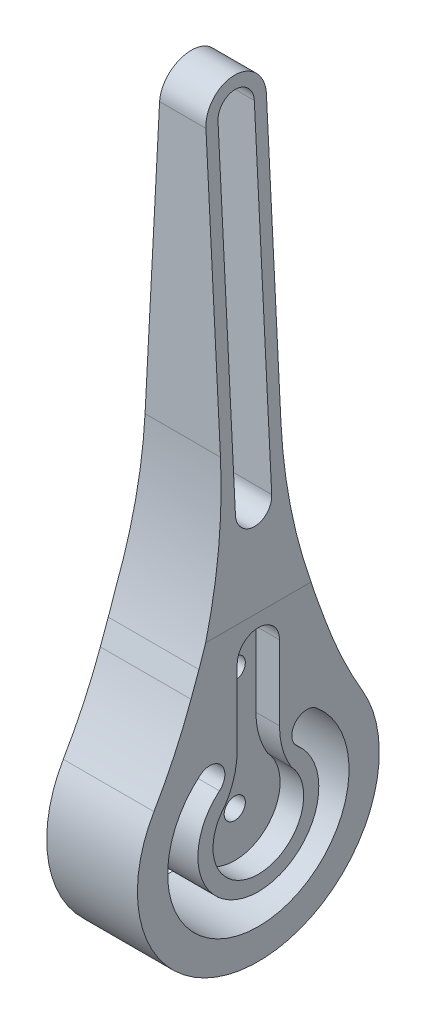
ISO-10303-21;
HEADER;
FILE_DESCRIPTION(('STEP AP214'),'2;1');
FILE_NAME('part.step','',(''),(''),'','','');
FILE_SCHEMA(('AUTOMOTIVE_DESIGN { 1 0 10303 214 1 1 1 1 }'));
ENDSEC;
DATA;
#1=APPLICATION_CONTEXT('core data for automotive mechanical design processes');
#2=APPLICATION_PROTOCOL_DEFINITION('international standard','automotive_design',2000,#1);
#3=PRODUCT_CONTEXT('',#1,'mechanical');
#4=PRODUCT('Part','Part','',(#3));
#5=PRODUCT_RELATED_PRODUCT_CATEGORY('part','',(#4));
#6=PRODUCT_DEFINITION_FORMATION('','',#4);
#7=PRODUCT_DEFINITION_CONTEXT('part definition',#1,'design');
#8=PRODUCT_DEFINITION('design','',#6,#7);
#9=PRODUCT_DEFINITION_SHAPE('','',#8);
#10=(LENGTH_UNIT() NAMED_UNIT(*) SI_UNIT(.MILLI.,.METRE.));
#11=(NAMED_UNIT(*) PLANE_ANGLE_UNIT() SI_UNIT($,.RADIAN.));
#12=(NAMED_UNIT(*) SI_UNIT($,.STERADIAN.) SOLID_ANGLE_UNIT());
#13=UNCERTAINTY_MEASURE_WITH_UNIT(LENGTH_MEASURE(1.E-05),#10,'distance_accuracy_value','');
#14=(GEOMETRIC_REPRESENTATION_CONTEXT(3) GLOBAL_UNCERTAINTY_ASSIGNED_CONTEXT((#13)) GLOBAL_UNIT_ASSIGNED_CONTEXT((#10,
#11,#12)) REPRESENTATION_CONTEXT('',''));
#15=CARTESIAN_POINT('',(0.,0.,0.));
#16=DIRECTION('',(0.,0.,1.));
#17=DIRECTION('',(1.,0.,0.));
#18=AXIS2_PLACEMENT_3D('',#15,#16,#17);
#19=CARTESIAN_POINT('',(-15.,50.4972860024262,86.3135221526105));
#20=DIRECTION('',(-1.,0.,0.));
#21=DIRECTION('',(0.,0.,1.));
#22=AXIS2_PLACEMENT_3D('',#19,#20,#21);
#23=PLANE('',#22);
#24=CARTESIAN_POINT('',(-15.,20.,0.));
#25=DIRECTION('',(1.,0.,0.));
#26=DIRECTION('',(0.,0.,-1.));
#27=AXIS2_PLACEMENT_3D('',#24,#25,#26);
#28=CIRCLE('',#27,1.75);
#29=CARTESIAN_POINT('',(-15.,20.,-1.75));
#30=VERTEX_POINT('',#29);
#31=EDGE_CURVE('E307',#30,#30,#28,.T.);
#32=ORIENTED_EDGE('',*,*,#31,.T.);
#33=EDGE_LOOP('',(#32));
#34=FACE_BOUND('',#33,.T.);
#35=CARTESIAN_POINT('',(-15.,24.,0.));
#36=DIRECTION('',(1.,0.,0.));
#37=DIRECTION('',(0.,0.,-1.));
#38=AXIS2_PLACEMENT_3D('',#35,#36,#37);
#39=CIRCLE('',#38,1.75);
#40=CARTESIAN_POINT('',(-15.,24.,-1.75));
#41=VERTEX_POINT('',#40);
#42=EDGE_CURVE('E299',#41,#41,#39,.T.);
#43=ORIENTED_EDGE('',*,*,#42,.T.);
#44=EDGE_LOOP('',(#43));
#45=FACE_BOUND('',#44,.T.);
#46=CARTESIAN_POINT('',(-15.,0.,0.));
#47=DIRECTION('',(1.,0.,0.));
#48=DIRECTION('',(0.,0.,-1.));
#49=AXIS2_PLACEMENT_3D('',#46,#47,#48);
#50=CIRCLE('',#49,1.75);
#51=CARTESIAN_POINT('',(-15.,0.,-1.75));
#52=VERTEX_POINT('',#51);
#53=EDGE_CURVE('E294',#52,#52,#50,.T.);
#54=ORIENTED_EDGE('',*,*,#53,.T.);
#55=EDGE_LOOP('',(#54));
#56=FACE_BOUND('',#55,.T.);
#57=DIRECTION('',(0.,0.,1.));
#58=VECTOR('',#57,1.);
#59=CARTESIAN_POINT('',(-15.,30.,-20.));
#60=LINE('',#59,#58);
#61=CARTESIAN_POINT('',(-15.,30.,-8.71833035085308));
#62=VERTEX_POINT('',#61);
#63=CARTESIAN_POINT('',(-15.,30.,8.71833035085308));
#64=VERTEX_POINT('',#63);
#65=EDGE_CURVE('E247',#62,#64,#60,.T.);
#66=ORIENTED_EDGE('',*,*,#65,.F.);
#67=CARTESIAN_POINT('',(-15.,54.1061584566769,-85.));
#68=DIRECTION('',(-1.,0.,0.));
#69=DIRECTION('',(0.,0.,1.));
#70=AXIS2_PLACEMENT_3D('',#67,#68,#69);
#71=CIRCLE('',#70,80.);
#72=CARTESIAN_POINT('',(-15.,26.7445469906236,-9.82459033712727));
#73=VERTEX_POINT('',#72);
#74=EDGE_CURVE('E386',#73,#62,#71,.T.);
#75=ORIENTED_EDGE('',*,*,#74,.F.);
#76=DIRECTION('',(0.,0.939692620785911,0.342020143325663));
#77=VECTOR('',#76,1.);
#78=CARTESIAN_POINT('',(-15.,26.7445469906236,-9.82459033712725));
#79=LINE('',#78,#77);
#80=CARTESIAN_POINT('',(-15.,23.1356745363731,-11.1381124897376));
#81=VERTEX_POINT('',#80);
#82=EDGE_CURVE('E383',#81,#73,#79,.T.);
#83=ORIENTED_EDGE('',*,*,#82,.F.);
#84=CARTESIAN_POINT('',(-15.,50.4972860024262,-86.3135221526105));
#85=DIRECTION('',(-1.,0.,0.));
#86=DIRECTION('',(0.,0.,-1.));
#87=AXIS2_PLACEMENT_3D('',#84,#85,#86);
#88=CIRCLE('',#87,80.);
#89=CARTESIAN_POINT('',(-15.,10.0994572004852,-17.2627044305221));
#90=VERTEX_POINT('',#89);
#91=EDGE_CURVE('E380',#90,#81,#88,.T.);
#92=ORIENTED_EDGE('',*,*,#91,.F.);
#93=CARTESIAN_POINT('',(-15.,0.,0.));
#94=DIRECTION('',(1.,0.,0.));
#95=DIRECTION('',(0.,0.,-1.));
#96=AXIS2_PLACEMENT_3D('',#93,#94,#95);
#97=CIRCLE('',#96,20.);
#98=CARTESIAN_POINT('',(-15.,10.0994572004852,17.2627044305221));
#99=VERTEX_POINT('',#98);
#100=EDGE_CURVE('E376',#99,#90,#97,.T.);
#101=ORIENTED_EDGE('',*,*,#100,.F.);
#102=CARTESIAN_POINT('',(-15.,50.4972860024262,86.3135221526105));
#103=DIRECTION('',(-1.,0.,0.));
#104=DIRECTION('',(0.,0.,1.));
#105=AXIS2_PLACEMENT_3D('',#102,#103,#104);
#106=CIRCLE('',#105,80.);
#107=CARTESIAN_POINT('',(-15.,23.1356745363731,11.1381124897376));
#108=VERTEX_POINT('',#107);
#109=EDGE_CURVE('E373',#108,#99,#106,.T.);
#110=ORIENTED_EDGE('',*,*,#109,.F.);
#111=DIRECTION('',(0.,-0.939692620785911,0.342020143325663));
#112=VECTOR('',#111,1.);
#113=CARTESIAN_POINT('',(-15.,26.7445469906236,9.82459033712725));
#114=LINE('',#113,#112);
#115=CARTESIAN_POINT('',(-15.,26.7445469906236,9.82459033712725));
#116=VERTEX_POINT('',#115);
#117=EDGE_CURVE('E391',#116,#108,#114,.T.);
#118=ORIENTED_EDGE('',*,*,#117,.F.);
#119=CARTESIAN_POINT('',(-15.,54.1061584566769,85.));
#120=DIRECTION('',(-1.,0.,0.));
#121=DIRECTION('',(0.,0.,-1.));
#122=AXIS2_PLACEMENT_3D('',#119,#120,#121);
#123=CIRCLE('',#122,80.);
#124=EDGE_CURVE('E389',#64,#116,#123,.T.);
#125=ORIENTED_EDGE('',*,*,#124,.F.);
#126=EDGE_LOOP('',(#66,#75,#83,#92,#101,#110,#118,#125));
#127=FACE_BOUND('',#126,.T.);
#128=CARTESIAN_POINT('',(-15.,9.57555553898721,-8.03484512108176));
#129=DIRECTION('',(1.,0.,0.));
#130=DIRECTION('',(0.,0.,1.));
#131=AXIS2_PLACEMENT_3D('',#128,#129,#130);
#132=CIRCLE('',#131,2.5);
#133=CARTESIAN_POINT('',(-15.,11.4906666467847,-9.64181414529811));
#134=VERTEX_POINT('',#133);
#135=CARTESIAN_POINT('',(-15.,7.66044443118977,-6.4278760968654));
#136=VERTEX_POINT('',#135);
#137=EDGE_CURVE('E218',#134,#136,#132,.T.);
#138=ORIENTED_EDGE('',*,*,#137,.T.);
#139=CARTESIAN_POINT('',(-15.,0.,0.));
#140=DIRECTION('',(-1.,0.,0.));
#141=DIRECTION('',(0.,0.,-1.));
#142=AXIS2_PLACEMENT_3D('',#139,#140,#141);
#143=CIRCLE('',#142,10.);
#144=CARTESIAN_POINT('',(-15.,7.66044443118977,6.4278760968654));
#145=VERTEX_POINT('',#144);
#146=EDGE_CURVE('E227',#136,#145,#143,.T.);
#147=ORIENTED_EDGE('',*,*,#146,.T.);
#148=CARTESIAN_POINT('',(-15.,9.57555553898721,8.03484512108176));
#149=DIRECTION('',(1.,0.,0.));
#150=DIRECTION('',(0.,0.,-1.));
#151=AXIS2_PLACEMENT_3D('',#148,#149,#150);
#152=CIRCLE('',#151,2.5);
#153=CARTESIAN_POINT('',(-15.,11.4906666467847,9.64181414529811));
#154=VERTEX_POINT('',#153);
#155=EDGE_CURVE('E58',#145,#154,#152,.T.);
#156=ORIENTED_EDGE('',*,*,#155,.T.);
#157=CARTESIAN_POINT('',(-15.,0.,0.));
#158=DIRECTION('',(1.,0.,0.));
#159=DIRECTION('',(0.,0.,-1.));
#160=AXIS2_PLACEMENT_3D('',#157,#158,#159);
#161=CIRCLE('',#160,15.);
#162=EDGE_CURVE('E224',#154,#134,#161,.T.);
#163=ORIENTED_EDGE('',*,*,#162,.T.);
#164=EDGE_LOOP('',(#138,#147,#156,#163));
#165=FACE_BOUND('',#164,.T.);
#166=ADVANCED_FACE('F43',(#34,#45,#56,#127,#165),#23,.T.);
#167=CARTESIAN_POINT('',(0.,50.4972860024262,86.3135221526105));
#168=DIRECTION('',(-1.,0.,0.));
#169=DIRECTION('',(0.,0.,1.));
#170=AXIS2_PLACEMENT_3D('',#167,#168,#169);
#171=PLANE('',#170);
#172=CARTESIAN_POINT('',(0.,0.,0.));
#173=DIRECTION('',(1.,0.,0.));
#174=DIRECTION('',(0.,0.,-1.));
#175=AXIS2_PLACEMENT_3D('',#172,#173,#174);
#176=CIRCLE('',#175,7.50000000000001);
#177=CARTESIAN_POINT('',(0.,5.15357012521902,5.44891869681042));
#178=VERTEX_POINT('',#177);
#179=CARTESIAN_POINT('',(0.,5.15357012521903,-5.4489186968104));
#180=VERTEX_POINT('',#179);
#181=EDGE_CURVE('E334',#178,#180,#176,.T.);
#182=ORIENTED_EDGE('',*,*,#181,.F.);
#183=CARTESIAN_POINT('',(0.,12.,16.5));
#184=DIRECTION('',(-1.,0.,0.));
#185=DIRECTION('',(0.,0.,1.));
#186=AXIS2_PLACEMENT_3D('',#183,#184,#185);
#187=CIRCLE('',#186,13.);
#188=CARTESIAN_POINT('',(0.,12.,3.50000000000002));
#189=VERTEX_POINT('',#188);
#190=EDGE_CURVE('E310',#189,#178,#187,.T.);
#191=ORIENTED_EDGE('',*,*,#190,.F.);
#192=DIRECTION('',(0.,-1.,0.));
#193=VECTOR('',#192,1.);
#194=CARTESIAN_POINT('',(0.,24.33053856,3.50000000000002));
#195=LINE('',#194,#193);
#196=CARTESIAN_POINT('',(0.,24.33053856,3.50000000000002));
#197=VERTEX_POINT('',#196);
#198=EDGE_CURVE('E317',#197,#189,#195,.T.);
#199=ORIENTED_EDGE('',*,*,#198,.F.);
#200=CARTESIAN_POINT('',(0.,24.33053856,0.));
#201=DIRECTION('',(1.,0.,0.));
#202=DIRECTION('',(0.,0.,-1.));
#203=AXIS2_PLACEMENT_3D('',#200,#201,#202);
#204=CIRCLE('',#203,3.5);
#205=CARTESIAN_POINT('',(0.,24.33053856,-3.49999999999999));
#206=VERTEX_POINT('',#205);
#207=EDGE_CURVE('E343',#206,#197,#204,.T.);
#208=ORIENTED_EDGE('',*,*,#207,.F.);
#209=DIRECTION('',(0.,1.,0.));
#210=VECTOR('',#209,1.);
#211=CARTESIAN_POINT('',(0.,24.33053856,-3.49999999999999));
#212=LINE('',#211,#210);
#213=CARTESIAN_POINT('',(0.,12.,-3.49999999999999));
#214=VERTEX_POINT('',#213);
#215=EDGE_CURVE('E340',#214,#206,#212,.T.);
#216=ORIENTED_EDGE('',*,*,#215,.F.);
#217=CARTESIAN_POINT('',(0.,12.,-16.5));
#218=DIRECTION('',(-1.,0.,0.));
#219=DIRECTION('',(0.,0.,-1.));
#220=AXIS2_PLACEMENT_3D('',#217,#218,#219);
#221=CIRCLE('',#220,13.);
#222=EDGE_CURVE('E337',#180,#214,#221,.T.);
#223=ORIENTED_EDGE('',*,*,#222,.F.);
#224=EDGE_LOOP('',(#182,#191,#199,#208,#216,#223));
#225=FACE_BOUND('',#224,.T.);
#226=CARTESIAN_POINT('',(0.,54.1061584566769,-85.));
#227=DIRECTION('',(-1.,0.,0.));
#228=DIRECTION('',(0.,0.,1.));
#229=AXIS2_PLACEMENT_3D('',#226,#227,#228);
#230=CIRCLE('',#229,80.);
#231=CARTESIAN_POINT('',(0.,26.7445469906236,-9.82459033712727));
#232=VERTEX_POINT('',#231);
#233=CARTESIAN_POINT('',(0.,30.,-8.71833035085308));
#234=VERTEX_POINT('',#233);
#235=EDGE_CURVE('E406',#232,#234,#230,.T.);
#236=ORIENTED_EDGE('',*,*,#235,.T.);
#237=DIRECTION('',(0.,0.,1.));
#238=VECTOR('',#237,1.);
#239=CARTESIAN_POINT('',(0.,30.,-20.));
#240=LINE('',#239,#238);
#241=CARTESIAN_POINT('',(0.,30.,8.71833035085308));
#242=VERTEX_POINT('',#241);
#243=EDGE_CURVE('E251',#234,#242,#240,.T.);
#244=ORIENTED_EDGE('',*,*,#243,.T.);
#245=CARTESIAN_POINT('',(0.,54.1061584566769,85.));
#246=DIRECTION('',(-1.,0.,0.));
#247=DIRECTION('',(0.,0.,-1.));
#248=AXIS2_PLACEMENT_3D('',#245,#246,#247);
#249=CIRCLE('',#248,80.);
#250=CARTESIAN_POINT('',(0.,26.7445469906236,9.82459033712725));
#251=VERTEX_POINT('',#250);
#252=EDGE_CURVE('E409',#242,#251,#249,.T.);
#253=ORIENTED_EDGE('',*,*,#252,.T.);
#254=DIRECTION('',(0.,-0.939692620785911,0.342020143325663));
#255=VECTOR('',#254,1.);
#256=CARTESIAN_POINT('',(0.,26.7445469906236,9.82459033712725));
#257=LINE('',#256,#255);
#258=CARTESIAN_POINT('',(0.,23.1356745363731,11.1381124897376));
#259=VERTEX_POINT('',#258);
#260=EDGE_CURVE('E377',#251,#259,#257,.T.);
#261=ORIENTED_EDGE('',*,*,#260,.T.);
#262=CARTESIAN_POINT('',(0.,50.4972860024262,86.3135221526105));
#263=DIRECTION('',(-1.,0.,0.));
#264=DIRECTION('',(0.,0.,1.));
#265=AXIS2_PLACEMENT_3D('',#262,#263,#264);
#266=CIRCLE('',#265,80.);
#267=CARTESIAN_POINT('',(0.,10.0994572004852,17.2627044305221));
#268=VERTEX_POINT('',#267);
#269=EDGE_CURVE('E364',#259,#268,#266,.T.);
#270=ORIENTED_EDGE('',*,*,#269,.T.);
#271=CARTESIAN_POINT('',(0.,0.,0.));
#272=DIRECTION('',(1.,0.,0.));
#273=DIRECTION('',(0.,0.,-1.));
#274=AXIS2_PLACEMENT_3D('',#271,#272,#273);
#275=CIRCLE('',#274,20.);
#276=CARTESIAN_POINT('',(0.,10.0994572004852,-17.2627044305221));
#277=VERTEX_POINT('',#276);
#278=EDGE_CURVE('E397',#268,#277,#275,.T.);
#279=ORIENTED_EDGE('',*,*,#278,.T.);
#280=CARTESIAN_POINT('',(0.,50.4972860024262,-86.3135221526105));
#281=DIRECTION('',(-1.,0.,0.));
#282=DIRECTION('',(0.,0.,-1.));
#283=AXIS2_PLACEMENT_3D('',#280,#281,#282);
#284=CIRCLE('',#283,80.);
#285=CARTESIAN_POINT('',(0.,23.1356745363731,-11.1381124897376));
#286=VERTEX_POINT('',#285);
#287=EDGE_CURVE('E400',#277,#286,#284,.T.);
#288=ORIENTED_EDGE('',*,*,#287,.T.);
#289=DIRECTION('',(0.,0.939692620785911,0.342020143325663));
#290=VECTOR('',#289,1.);
#291=CARTESIAN_POINT('',(0.,26.7445469906236,-9.82459033712725));
#292=LINE('',#291,#290);
#293=EDGE_CURVE('E403',#286,#232,#292,.T.);
#294=ORIENTED_EDGE('',*,*,#293,.T.);
#295=EDGE_LOOP('',(#236,#244,#253,#261,#270,#279,#288,#294));
#296=FACE_BOUND('',#295,.T.);
#297=CARTESIAN_POINT('',(0.,0.,0.));
#298=DIRECTION('',(-1.,0.,0.));
#299=DIRECTION('',(0.,0.,-1.));
#300=AXIS2_PLACEMENT_3D('',#297,#298,#299);
#301=CIRCLE('',#300,10.);
#302=CARTESIAN_POINT('',(0.,7.66044443118977,-6.4278760968654));
#303=VERTEX_POINT('',#302);
#304=CARTESIAN_POINT('',(0.,7.66044443118977,6.4278760968654));
#305=VERTEX_POINT('',#304);
#306=EDGE_CURVE('E241',#303,#305,#301,.T.);
#307=ORIENTED_EDGE('',*,*,#306,.F.);
#308=CARTESIAN_POINT('',(0.,9.57555553898721,-8.03484512108176));
#309=DIRECTION('',(1.,0.,0.));
#310=DIRECTION('',(0.,0.,1.));
#311=AXIS2_PLACEMENT_3D('',#308,#309,#310);
#312=CIRCLE('',#311,2.5);
#313=CARTESIAN_POINT('',(0.,11.4906666467847,-9.64181414529811));
#314=VERTEX_POINT('',#313);
#315=EDGE_CURVE('E66',#314,#303,#312,.T.);
#316=ORIENTED_EDGE('',*,*,#315,.F.);
#317=CARTESIAN_POINT('',(0.,0.,0.));
#318=DIRECTION('',(1.,0.,0.));
#319=DIRECTION('',(0.,0.,-1.));
#320=AXIS2_PLACEMENT_3D('',#317,#318,#319);
#321=CIRCLE('',#320,15.);
#322=CARTESIAN_POINT('',(0.,11.4906666467847,9.64181414529811));
#323=VERTEX_POINT('',#322);
#324=EDGE_CURVE('E232',#323,#314,#321,.T.);
#325=ORIENTED_EDGE('',*,*,#324,.F.);
#326=CARTESIAN_POINT('',(0.,9.57555553898721,8.03484512108176));
#327=DIRECTION('',(1.,0.,0.));
#328=DIRECTION('',(0.,0.,-1.));
#329=AXIS2_PLACEMENT_3D('',#326,#327,#328);
#330=CIRCLE('',#329,2.5);
#331=EDGE_CURVE('E235',#305,#323,#330,.T.);
#332=ORIENTED_EDGE('',*,*,#331,.F.);
#333=EDGE_LOOP('',(#307,#316,#325,#332));
#334=FACE_BOUND('',#333,.T.);
#335=ADVANCED_FACE('F469',(#225,#296,#334),#171,.F.);
#336=CARTESIAN_POINT('',(-15.,50.4972860024262,86.3135221526105));
#337=DIRECTION('',(1.,0.,0.));
#338=DIRECTION('',(0.,0.,-1.));
#339=AXIS2_PLACEMENT_3D('',#336,#337,#338);
#340=CYLINDRICAL_SURFACE('',#339,80.);
#341=ORIENTED_EDGE('',*,*,#269,.F.);
#342=DIRECTION('',(1.,0.,0.));
#343=VECTOR('',#342,1.);
#344=CARTESIAN_POINT('',(-15.,23.1356745363731,11.1381124897376));
#345=LINE('',#344,#343);
#346=EDGE_CURVE('E413',#108,#259,#345,.T.);
#347=ORIENTED_EDGE('',*,*,#346,.F.);
#348=ORIENTED_EDGE('',*,*,#109,.T.);
#349=DIRECTION('',(1.,0.,0.));
#350=VECTOR('',#349,1.);
#351=CARTESIAN_POINT('',(-15.,10.0994572004852,17.2627044305221));
#352=LINE('',#351,#350);
#353=EDGE_CURVE('E394',#99,#268,#352,.T.);
#354=ORIENTED_EDGE('',*,*,#353,.T.);
#355=EDGE_LOOP('',(#341,#347,#348,#354));
#356=FACE_BOUND('',#355,.T.);
#357=ADVANCED_FACE('F45',(#356),#340,.F.);
#358=CARTESIAN_POINT('',(-15.,26.7445469906236,9.82459033712725));
#359=DIRECTION('',(0.,0.342020143325663,0.93969262078591));
#360=DIRECTION('',(0.,-0.939692620785911,0.342020143325663));
#361=AXIS2_PLACEMENT_3D('',#358,#359,#360);
#362=PLANE('',#361);
#363=ORIENTED_EDGE('',*,*,#260,.F.);
#364=DIRECTION('',(1.,0.,0.));
#365=VECTOR('',#364,1.);
#366=CARTESIAN_POINT('',(-15.,26.7445469906236,9.82459033712725));
#367=LINE('',#366,#365);
#368=EDGE_CURVE('E415',#116,#251,#367,.T.);
#369=ORIENTED_EDGE('',*,*,#368,.F.);
#370=ORIENTED_EDGE('',*,*,#117,.T.);
#371=ORIENTED_EDGE('',*,*,#346,.T.);
#372=EDGE_LOOP('',(#363,#369,#370,#371));
#373=FACE_BOUND('',#372,.T.);
#374=ADVANCED_FACE('F482',(#373),#362,.T.);
#375=CARTESIAN_POINT('',(-15.,54.1061584566769,85.));
#376=DIRECTION('',(1.,0.,0.));
#377=DIRECTION('',(0.,0.,-1.));
#378=AXIS2_PLACEMENT_3D('',#375,#376,#377);
#379=CYLINDRICAL_SURFACE('',#378,80.);
#380=CARTESIAN_POINT('',(-1.26335023175937,54.1061584566769,85.));
#381=DIRECTION('',(-0.998629534754574,-0.0523359562429369,0.));
#382=DIRECTION('',(0.0523359562429369,-0.998629534754574,0.));
#383=AXIS2_PLACEMENT_3D('',#380,#381,#382);
#384=ELLIPSE('',#383,80.1097876798337,80.);
#385=CARTESIAN_POINT('',(-1.26335023175937,54.1061584566769,5.));
#386=VERTEX_POINT('',#385);
#387=EDGE_CURVE('E292',#386,#242,#384,.T.);
#388=ORIENTED_EDGE('',*,*,#387,.F.);
#389=DIRECTION('',(1.,0.,0.));
#390=VECTOR('',#389,1.);
#391=CARTESIAN_POINT('',(-15.,54.1061584566769,5.));
#392=LINE('',#391,#390);
#393=CARTESIAN_POINT('',(-13.7366497682406,54.1061584566769,5.));
#394=VERTEX_POINT('',#393);
#395=EDGE_CURVE('E418',#394,#386,#392,.T.);
#396=ORIENTED_EDGE('',*,*,#395,.F.);
#397=CARTESIAN_POINT('',(-13.7366497682406,54.1061584566769,85.));
#398=DIRECTION('',(0.998629534754574,-0.0523359562429369,0.));
#399=DIRECTION('',(0.0523359562429369,0.998629534754574,0.));
#400=AXIS2_PLACEMENT_3D('',#397,#398,#399);
#401=ELLIPSE('',#400,80.1097876798337,80.);
#402=EDGE_CURVE('E272',#64,#394,#401,.T.);
#403=ORIENTED_EDGE('',*,*,#402,.F.);
#404=ORIENTED_EDGE('',*,*,#124,.T.);
#405=ORIENTED_EDGE('',*,*,#368,.T.);
#406=ORIENTED_EDGE('',*,*,#252,.F.);
#407=EDGE_LOOP('',(#388,#396,#403,#404,#405,#406));
#408=FACE_BOUND('',#407,.T.);
#409=ADVANCED_FACE('F485',(#408),#379,.F.);
#410=CARTESIAN_POINT('',(-15.,54.1061584566772,5.));
#411=DIRECTION('',(0.,0.,1.));
#412=DIRECTION('',(0.,-1.,0.));
#413=AXIS2_PLACEMENT_3D('',#410,#411,#412);
#414=PLANE('',#413);
#415=DIRECTION('',(0.0523359562429369,-0.998629534754574,0.));
#416=VECTOR('',#415,1.);
#417=CARTESIAN_POINT('',(-1.30097563411928,54.8240939020372,5.));
#418=LINE('',#417,#416);
#419=CARTESIAN_POINT('',(-3.6685445498124,100.,5.));
#420=VERTEX_POINT('',#419);
#421=EDGE_CURVE('E290',#420,#386,#418,.T.);
#422=ORIENTED_EDGE('',*,*,#421,.F.);
#423=DIRECTION('',(1.,0.,0.));
#424=VECTOR('',#423,1.);
#425=CARTESIAN_POINT('',(-15.,100.,5.));
#426=LINE('',#425,#424);
#427=CARTESIAN_POINT('',(-11.3314554501876,100.,5.));
#428=VERTEX_POINT('',#427);
#429=EDGE_CURVE('E421',#428,#420,#426,.T.);
#430=ORIENTED_EDGE('',*,*,#429,.F.);
#431=DIRECTION('',(0.0523359562429369,0.998629534754574,0.));
#432=VECTOR('',#431,1.);
#433=CARTESIAN_POINT('',(-13.7401101506187,54.0401304275299,5.));
#434=LINE('',#433,#432);
#435=EDGE_CURVE('E270',#394,#428,#434,.T.);
#436=ORIENTED_EDGE('',*,*,#435,.F.);
#437=ORIENTED_EDGE('',*,*,#395,.T.);
#438=EDGE_LOOP('',(#422,#430,#436,#437));
#439=FACE_BOUND('',#438,.T.);
#440=ADVANCED_FACE('F489',(#439),#414,.T.);
#441=CARTESIAN_POINT('',(-15.,100.,0.));
#442=DIRECTION('',(1.,0.,0.));
#443=DIRECTION('',(0.,0.,-1.));
#444=AXIS2_PLACEMENT_3D('',#441,#442,#443);
#445=CYLINDRICAL_SURFACE('',#444,5.);
#446=CARTESIAN_POINT('',(-3.6685445498124,100.,0.));
#447=DIRECTION('',(-0.998629534754574,-0.0523359562429369,0.));
#448=DIRECTION('',(0.0523359562429369,-0.998629534754574,0.));
#449=AXIS2_PLACEMENT_3D('',#446,#447,#448);
#450=ELLIPSE('',#449,5.00686172998961,5.);
#451=CARTESIAN_POINT('',(-3.6685445498124,100.,-5.));
#452=VERTEX_POINT('',#451);
#453=EDGE_CURVE('E288',#452,#420,#450,.F.);
#454=ORIENTED_EDGE('',*,*,#453,.F.);
#455=DIRECTION('',(1.,0.,0.));
#456=VECTOR('',#455,1.);
#457=CARTESIAN_POINT('',(-15.,100.,-5.));
#458=LINE('',#457,#456);
#459=CARTESIAN_POINT('',(-11.3314554501876,100.,-5.));
#460=VERTEX_POINT('',#459);
#461=EDGE_CURVE('E424',#460,#452,#458,.T.);
#462=ORIENTED_EDGE('',*,*,#461,.F.);
#463=CARTESIAN_POINT('',(-11.3314554501876,100.,0.));
#464=DIRECTION('',(0.998629534754574,-0.0523359562429369,0.));
#465=DIRECTION('',(0.0523359562429369,0.998629534754574,0.));
#466=AXIS2_PLACEMENT_3D('',#463,#464,#465);
#467=ELLIPSE('',#466,5.00686172998961,5.);
#468=EDGE_CURVE('E268',#428,#460,#467,.F.);
#469=ORIENTED_EDGE('',*,*,#468,.F.);
#470=ORIENTED_EDGE('',*,*,#429,.T.);
#471=EDGE_LOOP('',(#454,#462,#469,#470));
#472=FACE_BOUND('',#471,.T.);
#473=ADVANCED_FACE('F493',(#472),#445,.T.);
#474=CARTESIAN_POINT('',(-15.,54.1061584566772,-5.));
#475=DIRECTION('',(0.,0.,-1.));
#476=DIRECTION('',(0.,1.,0.));
#477=AXIS2_PLACEMENT_3D('',#474,#475,#476);
#478=PLANE('',#477);
#479=DIRECTION('',(-0.0523359562429369,0.998629534754574,0.));
#480=VECTOR('',#479,1.);
#481=CARTESIAN_POINT('',(-1.30097563411928,54.8240939020372,-5.));
#482=LINE('',#481,#480);
#483=CARTESIAN_POINT('',(-1.26335023175939,54.1061584566772,-5.));
#484=VERTEX_POINT('',#483);
#485=EDGE_CURVE('E285',#484,#452,#482,.T.);
#486=ORIENTED_EDGE('',*,*,#485,.F.);
#487=DIRECTION('',(1.,0.,0.));
#488=VECTOR('',#487,1.);
#489=CARTESIAN_POINT('',(-15.,54.1061584566772,-5.));
#490=LINE('',#489,#488);
#491=CARTESIAN_POINT('',(-13.7366497682406,54.1061584566772,-5.));
#492=VERTEX_POINT('',#491);
#493=EDGE_CURVE('E427',#492,#484,#490,.T.);
#494=ORIENTED_EDGE('',*,*,#493,.F.);
#495=DIRECTION('',(-0.0523359562429369,-0.998629534754574,0.));
#496=VECTOR('',#495,1.);
#497=CARTESIAN_POINT('',(-13.7401101506187,54.0401304275299,-5.));
#498=LINE('',#497,#496);
#499=EDGE_CURVE('E266',#460,#492,#498,.T.);
#500=ORIENTED_EDGE('',*,*,#499,.F.);
#501=ORIENTED_EDGE('',*,*,#461,.T.);
#502=EDGE_LOOP('',(#486,#494,#500,#501));
#503=FACE_BOUND('',#502,.T.);
#504=ADVANCED_FACE('F497',(#503),#478,.T.);
#505=CARTESIAN_POINT('',(-15.,54.1061584566769,-85.));
#506=DIRECTION('',(1.,0.,0.));
#507=DIRECTION('',(0.,0.,-1.));
#508=AXIS2_PLACEMENT_3D('',#505,#506,#507);
#509=CYLINDRICAL_SURFACE('',#508,80.);
#510=CARTESIAN_POINT('',(-1.26335023175937,54.1061584566769,-85.));
#511=DIRECTION('',(-0.998629534754574,-0.0523359562429369,0.));
#512=DIRECTION('',(0.0523359562429369,-0.998629534754574,0.));
#513=AXIS2_PLACEMENT_3D('',#510,#511,#512);
#514=ELLIPSE('',#513,80.1097876798337,80.);
#515=EDGE_CURVE('E283',#234,#484,#514,.T.);
#516=ORIENTED_EDGE('',*,*,#515,.F.);
#517=ORIENTED_EDGE('',*,*,#235,.F.);
#518=DIRECTION('',(1.,0.,0.));
#519=VECTOR('',#518,1.);
#520=CARTESIAN_POINT('',(-15.,26.7445469906236,-9.82459033712727));
#521=LINE('',#520,#519);
#522=EDGE_CURVE('E430',#73,#232,#521,.T.);
#523=ORIENTED_EDGE('',*,*,#522,.F.);
#524=ORIENTED_EDGE('',*,*,#74,.T.);
#525=CARTESIAN_POINT('',(-13.7366497682406,54.1061584566769,-85.));
#526=DIRECTION('',(0.998629534754574,-0.0523359562429369,0.));
#527=DIRECTION('',(0.0523359562429369,0.998629534754574,0.));
#528=AXIS2_PLACEMENT_3D('',#525,#526,#527);
#529=ELLIPSE('',#528,80.1097876798337,80.);
#530=EDGE_CURVE('E264',#492,#62,#529,.T.);
#531=ORIENTED_EDGE('',*,*,#530,.F.);
#532=ORIENTED_EDGE('',*,*,#493,.T.);
#533=EDGE_LOOP('',(#516,#517,#523,#524,#531,#532));
#534=FACE_BOUND('',#533,.T.);
#535=ADVANCED_FACE('F501',(#534),#509,.F.);
#536=CARTESIAN_POINT('',(-15.,26.7445469906236,-9.82459033712725));
#537=DIRECTION('',(0.,0.342020143325663,-0.93969262078591));
#538=DIRECTION('',(0.,0.939692620785911,0.342020143325663));
#539=AXIS2_PLACEMENT_3D('',#536,#537,#538);
#540=PLANE('',#539);
#541=ORIENTED_EDGE('',*,*,#293,.F.);
#542=DIRECTION('',(1.,0.,0.));
#543=VECTOR('',#542,1.);
#544=CARTESIAN_POINT('',(-15.,23.1356745363731,-11.1381124897376));
#545=LINE('',#544,#543);
#546=EDGE_CURVE('E432',#81,#286,#545,.T.);
#547=ORIENTED_EDGE('',*,*,#546,.F.);
#548=ORIENTED_EDGE('',*,*,#82,.T.);
#549=ORIENTED_EDGE('',*,*,#522,.T.);
#550=EDGE_LOOP('',(#541,#547,#548,#549));
#551=FACE_BOUND('',#550,.T.);
#552=ADVANCED_FACE('F504',(#551),#540,.T.);
#553=CARTESIAN_POINT('',(-15.,50.4972860024262,-86.3135221526105));
#554=DIRECTION('',(1.,0.,0.));
#555=DIRECTION('',(0.,0.,-1.));
#556=AXIS2_PLACEMENT_3D('',#553,#554,#555);
#557=CYLINDRICAL_SURFACE('',#556,80.);
#558=ORIENTED_EDGE('',*,*,#287,.F.);
#559=DIRECTION('',(1.,0.,0.));
#560=VECTOR('',#559,1.);
#561=CARTESIAN_POINT('',(-15.,10.0994572004852,-17.2627044305221));
#562=LINE('',#561,#560);
#563=EDGE_CURVE('E434',#90,#277,#562,.T.);
#564=ORIENTED_EDGE('',*,*,#563,.F.);
#565=ORIENTED_EDGE('',*,*,#91,.T.);
#566=ORIENTED_EDGE('',*,*,#546,.T.);
#567=EDGE_LOOP('',(#558,#564,#565,#566));
#568=FACE_BOUND('',#567,.T.);
#569=ADVANCED_FACE('F508',(#568),#557,.F.);
#570=CARTESIAN_POINT('',(-15.,0.,0.));
#571=DIRECTION('',(1.,0.,0.));
#572=DIRECTION('',(0.,0.,-1.));
#573=AXIS2_PLACEMENT_3D('',#570,#571,#572);
#574=CYLINDRICAL_SURFACE('',#573,20.);
#575=ORIENTED_EDGE('',*,*,#278,.F.);
#576=ORIENTED_EDGE('',*,*,#353,.F.);
#577=ORIENTED_EDGE('',*,*,#100,.T.);
#578=ORIENTED_EDGE('',*,*,#563,.T.);
#579=EDGE_LOOP('',(#575,#576,#577,#578));
#580=FACE_BOUND('',#579,.T.);
#581=ADVANCED_FACE('F511',(#580),#574,.T.);
#582=CARTESIAN_POINT('',(-3.9,12.,16.5));
#583=DIRECTION('',(1.,0.,0.));
#584=DIRECTION('',(0.,0.,-1.));
#585=AXIS2_PLACEMENT_3D('',#582,#583,#584);
#586=CYLINDRICAL_SURFACE('',#585,13.);
#587=ORIENTED_EDGE('',*,*,#190,.T.);
#588=DIRECTION('',(1.,0.,0.));
#589=VECTOR('',#588,1.);
#590=CARTESIAN_POINT('',(-3.9,5.15357012521902,5.44891869681042));
#591=LINE('',#590,#589);
#592=CARTESIAN_POINT('',(-3.9,5.15357012521902,5.44891869681042));
#593=VERTEX_POINT('',#592);
#594=EDGE_CURVE('E332',#593,#178,#591,.T.);
#595=ORIENTED_EDGE('',*,*,#594,.F.);
#596=CARTESIAN_POINT('',(-3.9,12.,16.5));
#597=DIRECTION('',(-1.,0.,0.));
#598=DIRECTION('',(0.,0.,1.));
#599=AXIS2_PLACEMENT_3D('',#596,#597,#598);
#600=CIRCLE('',#599,13.);
#601=CARTESIAN_POINT('',(-3.9,12.,3.50000000000002));
#602=VERTEX_POINT('',#601);
#603=EDGE_CURVE('E313',#602,#593,#600,.T.);
#604=ORIENTED_EDGE('',*,*,#603,.F.);
#605=DIRECTION('',(1.,0.,0.));
#606=VECTOR('',#605,1.);
#607=CARTESIAN_POINT('',(-3.9,12.,3.50000000000002));
#608=LINE('',#607,#606);
#609=EDGE_CURVE('E348',#602,#189,#608,.T.);
#610=ORIENTED_EDGE('',*,*,#609,.T.);
#611=EDGE_LOOP('',(#587,#595,#604,#610));
#612=FACE_BOUND('',#611,.T.);
#613=ADVANCED_FACE('F514',(#612),#586,.T.);
#614=CARTESIAN_POINT('',(-3.9,24.33053856,3.50000000000002));
#615=DIRECTION('',(0.,0.,1.));
#616=DIRECTION('',(1.,0.,0.));
#617=AXIS2_PLACEMENT_3D('',#614,#615,#616);
#618=PLANE('',#617);
#619=ORIENTED_EDGE('',*,*,#198,.T.);
#620=ORIENTED_EDGE('',*,*,#609,.F.);
#621=DIRECTION('',(0.,-1.,0.));
#622=VECTOR('',#621,1.);
#623=CARTESIAN_POINT('',(-3.9,24.33053856,3.50000000000002));
#624=LINE('',#623,#622);
#625=CARTESIAN_POINT('',(-3.9,24.33053856,3.50000000000002));
#626=VERTEX_POINT('',#625);
#627=EDGE_CURVE('E329',#626,#602,#624,.T.);
#628=ORIENTED_EDGE('',*,*,#627,.F.);
#629=DIRECTION('',(1.,0.,0.));
#630=VECTOR('',#629,1.);
#631=CARTESIAN_POINT('',(-3.9,24.33053856,3.50000000000002));
#632=LINE('',#631,#630);
#633=EDGE_CURVE('E351',#626,#197,#632,.T.);
#634=ORIENTED_EDGE('',*,*,#633,.T.);
#635=EDGE_LOOP('',(#619,#620,#628,#634));
#636=FACE_BOUND('',#635,.T.);
#637=ADVANCED_FACE('F519',(#636),#618,.F.);
#638=CARTESIAN_POINT('',(-3.9,24.33053856,0.));
#639=DIRECTION('',(1.,0.,0.));
#640=DIRECTION('',(0.,0.,-1.));
#641=AXIS2_PLACEMENT_3D('',#638,#639,#640);
#642=CYLINDRICAL_SURFACE('',#641,3.5);
#643=ORIENTED_EDGE('',*,*,#207,.T.);
#644=ORIENTED_EDGE('',*,*,#633,.F.);
#645=CARTESIAN_POINT('',(-3.9,24.33053856,0.));
#646=DIRECTION('',(1.,0.,0.));
#647=DIRECTION('',(0.,0.,-1.));
#648=AXIS2_PLACEMENT_3D('',#645,#646,#647);
#649=CIRCLE('',#648,3.5);
#650=CARTESIAN_POINT('',(-3.9,24.33053856,-3.49999999999999));
#651=VERTEX_POINT('',#650);
#652=EDGE_CURVE('E326',#651,#626,#649,.T.);
#653=ORIENTED_EDGE('',*,*,#652,.F.);
#654=DIRECTION('',(1.,0.,0.));
#655=VECTOR('',#654,1.);
#656=CARTESIAN_POINT('',(-3.9,24.33053856,-3.49999999999999));
#657=LINE('',#656,#655);
#658=EDGE_CURVE('E353',#651,#206,#657,.T.);
#659=ORIENTED_EDGE('',*,*,#658,.T.);
#660=EDGE_LOOP('',(#643,#644,#653,#659));
#661=FACE_BOUND('',#660,.T.);
#662=ADVANCED_FACE('F624',(#661),#642,.F.);
#663=CARTESIAN_POINT('',(-3.9,24.33053856,-3.49999999999999));
#664=DIRECTION('',(0.,0.,-1.));
#665=DIRECTION('',(0.,1.,0.));
#666=AXIS2_PLACEMENT_3D('',#663,#664,#665);
#667=PLANE('',#666);
#668=ORIENTED_EDGE('',*,*,#215,.T.);
#669=ORIENTED_EDGE('',*,*,#658,.F.);
#670=DIRECTION('',(0.,1.,0.));
#671=VECTOR('',#670,1.);
#672=CARTESIAN_POINT('',(-3.9,24.33053856,-3.49999999999999));
#673=LINE('',#672,#671);
#674=CARTESIAN_POINT('',(-3.9,12.,-3.49999999999999));
#675=VERTEX_POINT('',#674);
#676=EDGE_CURVE('E323',#675,#651,#673,.T.);
#677=ORIENTED_EDGE('',*,*,#676,.F.);
#678=DIRECTION('',(1.,0.,0.));
#679=VECTOR('',#678,1.);
#680=CARTESIAN_POINT('',(-3.9,12.,-3.49999999999999));
#681=LINE('',#680,#679);
#682=EDGE_CURVE('E355',#675,#214,#681,.T.);
#683=ORIENTED_EDGE('',*,*,#682,.T.);
#684=EDGE_LOOP('',(#668,#669,#677,#683));
#685=FACE_BOUND('',#684,.T.);
#686=ADVANCED_FACE('F634',(#685),#667,.F.);
#687=CARTESIAN_POINT('',(-3.9,12.,-16.5));
#688=DIRECTION('',(1.,0.,0.));
#689=DIRECTION('',(0.,0.,-1.));
#690=AXIS2_PLACEMENT_3D('',#687,#688,#689);
#691=CYLINDRICAL_SURFACE('',#690,13.);
#692=ORIENTED_EDGE('',*,*,#222,.T.);
#693=ORIENTED_EDGE('',*,*,#682,.F.);
#694=CARTESIAN_POINT('',(-3.9,12.,-16.5));
#695=DIRECTION('',(-1.,0.,0.));
#696=DIRECTION('',(0.,0.,-1.));
#697=AXIS2_PLACEMENT_3D('',#694,#695,#696);
#698=CIRCLE('',#697,13.);
#699=CARTESIAN_POINT('',(-3.9,5.15357012521903,-5.4489186968104));
#700=VERTEX_POINT('',#699);
#701=EDGE_CURVE('E320',#700,#675,#698,.T.);
#702=ORIENTED_EDGE('',*,*,#701,.F.);
#703=DIRECTION('',(1.,0.,0.));
#704=VECTOR('',#703,1.);
#705=CARTESIAN_POINT('',(-3.9,5.15357012521903,-5.4489186968104));
#706=LINE('',#705,#704);
#707=EDGE_CURVE('E357',#700,#180,#706,.T.);
#708=ORIENTED_EDGE('',*,*,#707,.T.);
#709=EDGE_LOOP('',(#692,#693,#702,#708));
#710=FACE_BOUND('',#709,.T.);
#711=ADVANCED_FACE('F644',(#710),#691,.T.);
#712=CARTESIAN_POINT('',(-3.9,0.,0.));
#713=DIRECTION('',(1.,0.,0.));
#714=DIRECTION('',(0.,0.,-1.));
#715=AXIS2_PLACEMENT_3D('',#712,#713,#714);
#716=CYLINDRICAL_SURFACE('',#715,7.50000000000001);
#717=ORIENTED_EDGE('',*,*,#181,.T.);
#718=ORIENTED_EDGE('',*,*,#707,.F.);
#719=CARTESIAN_POINT('',(-3.9,0.,0.));
#720=DIRECTION('',(1.,0.,0.));
#721=DIRECTION('',(0.,0.,-1.));
#722=AXIS2_PLACEMENT_3D('',#719,#720,#721);
#723=CIRCLE('',#722,7.50000000000001);
#724=EDGE_CURVE('E316',#593,#700,#723,.T.);
#725=ORIENTED_EDGE('',*,*,#724,.F.);
#726=ORIENTED_EDGE('',*,*,#594,.T.);
#727=EDGE_LOOP('',(#717,#718,#725,#726));
#728=FACE_BOUND('',#727,.T.);
#729=ADVANCED_FACE('F654',(#728),#716,.F.);
#730=CARTESIAN_POINT('',(-3.9,12.,16.5));
#731=DIRECTION('',(-1.,0.,0.));
#732=DIRECTION('',(0.,0.,1.));
#733=AXIS2_PLACEMENT_3D('',#730,#731,#732);
#734=PLANE('',#733);
#735=CARTESIAN_POINT('',(-3.9,0.,0.));
#736=DIRECTION('',(1.,0.,0.));
#737=DIRECTION('',(0.,0.,-1.));
#738=AXIS2_PLACEMENT_3D('',#735,#736,#737);
#739=CIRCLE('',#738,1.75);
#740=CARTESIAN_POINT('',(-3.9,0.,-1.75));
#741=VERTEX_POINT('',#740);
#742=EDGE_CURVE('E302',#741,#741,#739,.T.);
#743=ORIENTED_EDGE('',*,*,#742,.F.);
#744=EDGE_LOOP('',(#743));
#745=FACE_BOUND('',#744,.T.);
#746=CARTESIAN_POINT('',(-3.9,24.,0.));
#747=DIRECTION('',(1.,0.,0.));
#748=DIRECTION('',(0.,0.,-1.));
#749=AXIS2_PLACEMENT_3D('',#746,#747,#748);
#750=CIRCLE('',#749,1.75);
#751=CARTESIAN_POINT('',(-3.9,24.,-1.75));
#752=VERTEX_POINT('',#751);
#753=EDGE_CURVE('E295',#752,#752,#750,.T.);
#754=ORIENTED_EDGE('',*,*,#753,.F.);
#755=EDGE_LOOP('',(#754));
#756=FACE_BOUND('',#755,.T.);
#757=CARTESIAN_POINT('',(-3.9,20.,0.));
#758=DIRECTION('',(1.,0.,0.));
#759=DIRECTION('',(0.,0.,-1.));
#760=AXIS2_PLACEMENT_3D('',#757,#758,#759);
#761=CIRCLE('',#760,1.75);
#762=CARTESIAN_POINT('',(-3.9,20.,-1.75));
#763=VERTEX_POINT('',#762);
#764=EDGE_CURVE('E298',#763,#763,#761,.T.);
#765=ORIENTED_EDGE('',*,*,#764,.F.);
#766=EDGE_LOOP('',(#765));
#767=FACE_BOUND('',#766,.T.);
#768=ORIENTED_EDGE('',*,*,#603,.T.);
#769=ORIENTED_EDGE('',*,*,#724,.T.);
#770=ORIENTED_EDGE('',*,*,#701,.T.);
#771=ORIENTED_EDGE('',*,*,#676,.T.);
#772=ORIENTED_EDGE('',*,*,#652,.T.);
#773=ORIENTED_EDGE('',*,*,#627,.T.);
#774=EDGE_LOOP('',(#768,#769,#770,#771,#772,#773));
#775=FACE_BOUND('',#774,.T.);
#776=ADVANCED_FACE('F664',(#745,#756,#767,#775),#734,.F.);
#777=CARTESIAN_POINT('',(-15.,20.,0.));
#778=DIRECTION('',(1.,0.,0.));
#779=DIRECTION('',(0.,0.,-1.));
#780=AXIS2_PLACEMENT_3D('',#777,#778,#779);
#781=CYLINDRICAL_SURFACE('',#780,1.75);
#782=ORIENTED_EDGE('',*,*,#31,.F.);
#783=EDGE_LOOP('',(#782));
#784=FACE_BOUND('',#783,.T.);
#785=ORIENTED_EDGE('',*,*,#764,.T.);
#786=EDGE_LOOP('',(#785));
#787=FACE_BOUND('',#786,.T.);
#788=ADVANCED_FACE('F674',(#784,#787),#781,.F.);
#789=CARTESIAN_POINT('',(-15.,24.,0.));
#790=DIRECTION('',(1.,0.,0.));
#791=DIRECTION('',(0.,0.,-1.));
#792=AXIS2_PLACEMENT_3D('',#789,#790,#791);
#793=CYLINDRICAL_SURFACE('',#792,1.75);
#794=ORIENTED_EDGE('',*,*,#42,.F.);
#795=EDGE_LOOP('',(#794));
#796=FACE_BOUND('',#795,.T.);
#797=ORIENTED_EDGE('',*,*,#753,.T.);
#798=EDGE_LOOP('',(#797));
#799=FACE_BOUND('',#798,.T.);
#800=ADVANCED_FACE('F464',(#796,#799),#793,.F.);
#801=CARTESIAN_POINT('',(-15.,0.,0.));
#802=DIRECTION('',(1.,0.,0.));
#803=DIRECTION('',(0.,0.,-1.));
#804=AXIS2_PLACEMENT_3D('',#801,#802,#803);
#805=CYLINDRICAL_SURFACE('',#804,1.75);
#806=ORIENTED_EDGE('',*,*,#53,.F.);
#807=EDGE_LOOP('',(#806));
#808=FACE_BOUND('',#807,.T.);
#809=ORIENTED_EDGE('',*,*,#742,.T.);
#810=EDGE_LOOP('',(#809));
#811=FACE_BOUND('',#810,.T.);
#812=ADVANCED_FACE('F454',(#808,#811),#805,.F.);
#813=CARTESIAN_POINT('',(-15.,30.,-20.));
#814=DIRECTION('',(0.998629534754574,-0.0523359562429369,0.));
#815=DIRECTION('',(0.0523359562429369,0.998629534754574,0.));
#816=AXIS2_PLACEMENT_3D('',#813,#814,#815);
#817=PLANE('',#816);
#818=ORIENTED_EDGE('',*,*,#402,.T.);
#819=ORIENTED_EDGE('',*,*,#435,.T.);
#820=ORIENTED_EDGE('',*,*,#468,.T.);
#821=ORIENTED_EDGE('',*,*,#499,.T.);
#822=ORIENTED_EDGE('',*,*,#530,.T.);
#823=ORIENTED_EDGE('',*,*,#65,.T.);
#824=EDGE_LOOP('',(#818,#819,#820,#821,#822,#823));
#825=FACE_BOUND('',#824,.T.);
#826=DIRECTION('',(-0.0523359562429369,-0.998629534754574,0.));
#827=VECTOR('',#826,1.);
#828=CARTESIAN_POINT('',(-14.2160365254927,44.9589142152621,-3.));
#829=LINE('',#828,#827);
#830=CARTESIAN_POINT('',(-11.3314554501876,100.,-3.00000000000001));
#831=VERTEX_POINT('',#830);
#832=CARTESIAN_POINT('',(-14.2138833107545,45.,-3.));
#833=VERTEX_POINT('',#832);
#834=EDGE_CURVE('E51',#831,#833,#829,.T.);
#835=ORIENTED_EDGE('',*,*,#834,.F.);
#836=CARTESIAN_POINT('',(-11.3314554501876,100.,0.));
#837=DIRECTION('',(0.998629534754574,-0.0523359562429369,0.));
#838=DIRECTION('',(0.0523359562429369,0.998629534754574,0.));
#839=AXIS2_PLACEMENT_3D('',#836,#837,#838);
#840=ELLIPSE('',#839,3.00411703799377,3.00000000000001);
#841=CARTESIAN_POINT('',(-11.3314554501876,100.,3.00000000000001));
#842=VERTEX_POINT('',#841);
#843=EDGE_CURVE('E254',#842,#831,#840,.F.);
#844=ORIENTED_EDGE('',*,*,#843,.F.);
#845=DIRECTION('',(0.0523359562429369,0.998629534754574,0.));
#846=VECTOR('',#845,1.);
#847=CARTESIAN_POINT('',(-14.2160365254927,44.9589142152621,3.));
#848=LINE('',#847,#846);
#849=CARTESIAN_POINT('',(-14.2138833107545,45.,3.));
#850=VERTEX_POINT('',#849);
#851=EDGE_CURVE('E258',#850,#842,#848,.T.);
#852=ORIENTED_EDGE('',*,*,#851,.F.);
#853=CARTESIAN_POINT('',(-14.2138833107545,45.,0.));
#854=DIRECTION('',(0.998629534754574,-0.0523359562429369,0.));
#855=DIRECTION('',(0.0523359562429369,0.998629534754574,0.));
#856=AXIS2_PLACEMENT_3D('',#853,#854,#855);
#857=ELLIPSE('',#856,3.00411703799376,3.);
#858=EDGE_CURVE('E261',#833,#850,#857,.F.);
#859=ORIENTED_EDGE('',*,*,#858,.F.);
#860=EDGE_LOOP('',(#835,#844,#852,#859));
#861=FACE_BOUND('',#860,.T.);
#862=ADVANCED_FACE('F452',(#825,#861),#817,.F.);
#863=CARTESIAN_POINT('',(0.,30.,-20.));
#864=DIRECTION('',(-0.998629534754574,-0.0523359562429369,0.));
#865=DIRECTION('',(0.0523359562429369,-0.998629534754574,0.));
#866=AXIS2_PLACEMENT_3D('',#863,#864,#865);
#867=PLANE('',#866);
#868=ORIENTED_EDGE('',*,*,#387,.T.);
#869=ORIENTED_EDGE('',*,*,#243,.F.);
#870=ORIENTED_EDGE('',*,*,#515,.T.);
#871=ORIENTED_EDGE('',*,*,#485,.T.);
#872=ORIENTED_EDGE('',*,*,#453,.T.);
#873=ORIENTED_EDGE('',*,*,#421,.T.);
#874=EDGE_LOOP('',(#868,#869,#870,#871,#872,#873));
#875=FACE_BOUND('',#874,.T.);
#876=DIRECTION('',(0.0523359562429369,-0.998629534754574,0.));
#877=VECTOR('',#876,1.);
#878=CARTESIAN_POINT('',(-0.825049259245236,45.7428776897694,3.));
#879=LINE('',#878,#877);
#880=CARTESIAN_POINT('',(-3.6685445498124,100.,3.00000000000001));
#881=VERTEX_POINT('',#880);
#882=CARTESIAN_POINT('',(-0.786116689245513,45.,3.));
#883=VERTEX_POINT('',#882);
#884=EDGE_CURVE('E277',#881,#883,#879,.T.);
#885=ORIENTED_EDGE('',*,*,#884,.F.);
#886=CARTESIAN_POINT('',(-3.6685445498124,100.,0.));
#887=DIRECTION('',(-0.998629534754574,-0.0523359562429369,0.));
#888=DIRECTION('',(0.0523359562429369,-0.998629534754574,0.));
#889=AXIS2_PLACEMENT_3D('',#886,#887,#888);
#890=ELLIPSE('',#889,3.00411703799377,3.00000000000001);
#891=CARTESIAN_POINT('',(-3.6685445498124,100.,-3.00000000000001));
#892=VERTEX_POINT('',#891);
#893=EDGE_CURVE('E274',#892,#881,#890,.F.);
#894=ORIENTED_EDGE('',*,*,#893,.F.);
#895=DIRECTION('',(-0.0523359562429369,0.998629534754574,0.));
#896=VECTOR('',#895,1.);
#897=CARTESIAN_POINT('',(-0.825049259245236,45.7428776897694,-3.));
#898=LINE('',#897,#896);
#899=CARTESIAN_POINT('',(-0.786116689245513,45.,-3.));
#900=VERTEX_POINT('',#899);
#901=EDGE_CURVE('E11',#900,#892,#898,.T.);
#902=ORIENTED_EDGE('',*,*,#901,.F.);
#903=CARTESIAN_POINT('',(-0.786116689245515,45.,0.));
#904=DIRECTION('',(-0.998629534754574,-0.0523359562429369,0.));
#905=DIRECTION('',(0.0523359562429369,-0.998629534754574,0.));
#906=AXIS2_PLACEMENT_3D('',#903,#904,#905);
#907=ELLIPSE('',#906,3.00411703799376,3.);
#908=EDGE_CURVE('E280',#883,#900,#907,.F.);
#909=ORIENTED_EDGE('',*,*,#908,.F.);
#910=EDGE_LOOP('',(#885,#894,#902,#909));
#911=FACE_BOUND('',#910,.T.);
#912=ADVANCED_FACE('F446',(#875,#911),#867,.F.);
#913=CARTESIAN_POINT('',(-15.,45.,-3.));
#914=DIRECTION('',(0.,0.,-1.));
#915=DIRECTION('',(0.,1.,0.));
#916=AXIS2_PLACEMENT_3D('',#913,#914,#915);
#917=PLANE('',#916);
#918=DIRECTION('',(1.,0.,0.));
#919=VECTOR('',#918,1.);
#920=CARTESIAN_POINT('',(-15.,45.,-3.));
#921=LINE('',#920,#919);
#922=EDGE_CURVE('E350',#833,#900,#921,.T.);
#923=ORIENTED_EDGE('',*,*,#922,.T.);
#924=ORIENTED_EDGE('',*,*,#901,.T.);
#925=DIRECTION('',(1.,0.,0.));
#926=VECTOR('',#925,1.);
#927=CARTESIAN_POINT('',(-15.,100.,-3.00000000000001));
#928=LINE('',#927,#926);
#929=EDGE_CURVE('E368',#831,#892,#928,.T.);
#930=ORIENTED_EDGE('',*,*,#929,.F.);
#931=ORIENTED_EDGE('',*,*,#834,.T.);
#932=EDGE_LOOP('',(#923,#924,#930,#931));
#933=FACE_BOUND('',#932,.T.);
#934=ADVANCED_FACE('F440',(#933),#917,.F.);
#935=CARTESIAN_POINT('',(-15.,100.,0.));
#936=DIRECTION('',(1.,0.,0.));
#937=DIRECTION('',(0.,0.,-1.));
#938=AXIS2_PLACEMENT_3D('',#935,#936,#937);
#939=CYLINDRICAL_SURFACE('',#938,3.00000000000001);
#940=ORIENTED_EDGE('',*,*,#929,.T.);
#941=ORIENTED_EDGE('',*,*,#893,.T.);
#942=DIRECTION('',(1.,0.,0.));
#943=VECTOR('',#942,1.);
#944=CARTESIAN_POINT('',(-15.,100.,3.00000000000001));
#945=LINE('',#944,#943);
#946=EDGE_CURVE('E365',#842,#881,#945,.T.);
#947=ORIENTED_EDGE('',*,*,#946,.F.);
#948=ORIENTED_EDGE('',*,*,#843,.T.);
#949=EDGE_LOOP('',(#940,#941,#947,#948));
#950=FACE_BOUND('',#949,.T.);
#951=ADVANCED_FACE('F451',(#950),#939,.F.);
#952=CARTESIAN_POINT('',(-15.,45.,3.));
#953=DIRECTION('',(0.,0.,1.));
#954=DIRECTION('',(0.,-1.,0.));
#955=AXIS2_PLACEMENT_3D('',#952,#953,#954);
#956=PLANE('',#955);
#957=ORIENTED_EDGE('',*,*,#946,.T.);
#958=ORIENTED_EDGE('',*,*,#884,.T.);
#959=DIRECTION('',(1.,0.,0.));
#960=VECTOR('',#959,1.);
#961=CARTESIAN_POINT('',(-15.,45.,3.));
#962=LINE('',#961,#960);
#963=EDGE_CURVE('E361',#850,#883,#962,.T.);
#964=ORIENTED_EDGE('',*,*,#963,.F.);
#965=ORIENTED_EDGE('',*,*,#851,.T.);
#966=EDGE_LOOP('',(#957,#958,#964,#965));
#967=FACE_BOUND('',#966,.T.);
#968=ADVANCED_FACE('F448',(#967),#956,.F.);
#969=CARTESIAN_POINT('',(-15.,45.,0.));
#970=DIRECTION('',(1.,0.,0.));
#971=DIRECTION('',(0.,0.,-1.));
#972=AXIS2_PLACEMENT_3D('',#969,#970,#971);
#973=CYLINDRICAL_SURFACE('',#972,3.);
#974=ORIENTED_EDGE('',*,*,#963,.T.);
#975=ORIENTED_EDGE('',*,*,#908,.T.);
#976=ORIENTED_EDGE('',*,*,#922,.F.);
#977=ORIENTED_EDGE('',*,*,#858,.T.);
#978=EDGE_LOOP('',(#974,#975,#976,#977));
#979=FACE_BOUND('',#978,.T.);
#980=ADVANCED_FACE('F443',(#979),#973,.F.);
#981=CARTESIAN_POINT('',(-15.,9.57555553898721,-8.03484512108176));
#982=DIRECTION('',(1.,0.,0.));
#983=DIRECTION('',(0.,0.,-1.));
#984=AXIS2_PLACEMENT_3D('',#981,#982,#983);
#985=CYLINDRICAL_SURFACE('',#984,2.5);
#986=ORIENTED_EDGE('',*,*,#315,.T.);
#987=DIRECTION('',(1.,0.,0.));
#988=VECTOR('',#987,1.);
#989=CARTESIAN_POINT('',(-15.,7.66044443118977,-6.4278760968654));
#990=LINE('',#989,#988);
#991=EDGE_CURVE('E214',#136,#303,#990,.T.);
#992=ORIENTED_EDGE('',*,*,#991,.F.);
#993=ORIENTED_EDGE('',*,*,#137,.F.);
#994=DIRECTION('',(1.,0.,0.));
#995=VECTOR('',#994,1.);
#996=CARTESIAN_POINT('',(-15.,11.4906666467847,-9.64181414529811));
#997=LINE('',#996,#995);
#998=EDGE_CURVE('E245',#134,#314,#997,.T.);
#999=ORIENTED_EDGE('',*,*,#998,.T.);
#1000=EDGE_LOOP('',(#986,#992,#993,#999));
#1001=FACE_BOUND('',#1000,.T.);
#1002=ADVANCED_FACE('F216',(#1001),#985,.F.);
#1003=CARTESIAN_POINT('',(-15.,0.,0.));
#1004=DIRECTION('',(1.,0.,0.));
#1005=DIRECTION('',(0.,0.,-1.));
#1006=AXIS2_PLACEMENT_3D('',#1003,#1004,#1005);
#1007=CYLINDRICAL_SURFACE('',#1006,15.);
#1008=ORIENTED_EDGE('',*,*,#324,.T.);
#1009=ORIENTED_EDGE('',*,*,#998,.F.);
#1010=ORIENTED_EDGE('',*,*,#162,.F.);
#1011=DIRECTION('',(1.,0.,0.));
#1012=VECTOR('',#1011,1.);
#1013=CARTESIAN_POINT('',(-15.,11.4906666467847,9.64181414529811));
#1014=LINE('',#1013,#1012);
#1015=EDGE_CURVE('E248',#154,#323,#1014,.T.);
#1016=ORIENTED_EDGE('',*,*,#1015,.T.);
#1017=EDGE_LOOP('',(#1008,#1009,#1010,#1016));
#1018=FACE_BOUND('',#1017,.T.);
#1019=ADVANCED_FACE('F726',(#1018),#1007,.F.);
#1020=CARTESIAN_POINT('',(-15.,9.57555553898721,8.03484512108176));
#1021=DIRECTION('',(1.,0.,0.));
#1022=DIRECTION('',(0.,0.,-1.));
#1023=AXIS2_PLACEMENT_3D('',#1020,#1021,#1022);
#1024=CYLINDRICAL_SURFACE('',#1023,2.5);
#1025=ORIENTED_EDGE('',*,*,#331,.T.);
#1026=ORIENTED_EDGE('',*,*,#1015,.F.);
#1027=ORIENTED_EDGE('',*,*,#155,.F.);
#1028=DIRECTION('',(1.,0.,0.));
#1029=VECTOR('',#1028,1.);
#1030=CARTESIAN_POINT('',(-15.,7.66044443118977,6.4278760968654));
#1031=LINE('',#1030,#1029);
#1032=EDGE_CURVE('E223',#145,#305,#1031,.T.);
#1033=ORIENTED_EDGE('',*,*,#1032,.T.);
#1034=EDGE_LOOP('',(#1025,#1026,#1027,#1033));
#1035=FACE_BOUND('',#1034,.T.);
#1036=ADVANCED_FACE('F735',(#1035),#1024,.F.);
#1037=CARTESIAN_POINT('',(-15.,0.,0.));
#1038=DIRECTION('',(1.,0.,0.));
#1039=DIRECTION('',(0.,0.,-1.));
#1040=AXIS2_PLACEMENT_3D('',#1037,#1038,#1039);
#1041=CYLINDRICAL_SURFACE('',#1040,10.);
#1042=ORIENTED_EDGE('',*,*,#306,.T.);
#1043=ORIENTED_EDGE('',*,*,#1032,.F.);
#1044=ORIENTED_EDGE('',*,*,#146,.F.);
#1045=ORIENTED_EDGE('',*,*,#991,.T.);
#1046=EDGE_LOOP('',(#1042,#1043,#1044,#1045));
#1047=FACE_BOUND('',#1046,.T.);
#1048=ADVANCED_FACE('F228',(#1047),#1041,.T.);
#1049=CLOSED_SHELL('',(#166,#335,#357,#374,#409,#440,#473,#504,#535,#552,#569,#581,#613,#637,
#662,#686,#711,#729,#776,#788,#800,#812,#862,#912,#934,#951,#968,#980,#1002,#1019,#1036,#1048));
#1050=MANIFOLD_SOLID_BREP('B2',#1049);
#1051=ADVANCED_BREP_SHAPE_REPRESENTATION('',(#18,#1050),#14);
#1052=SHAPE_DEFINITION_REPRESENTATION(#9,#1051);
ENDSEC;
END-ISO-10303-21;
